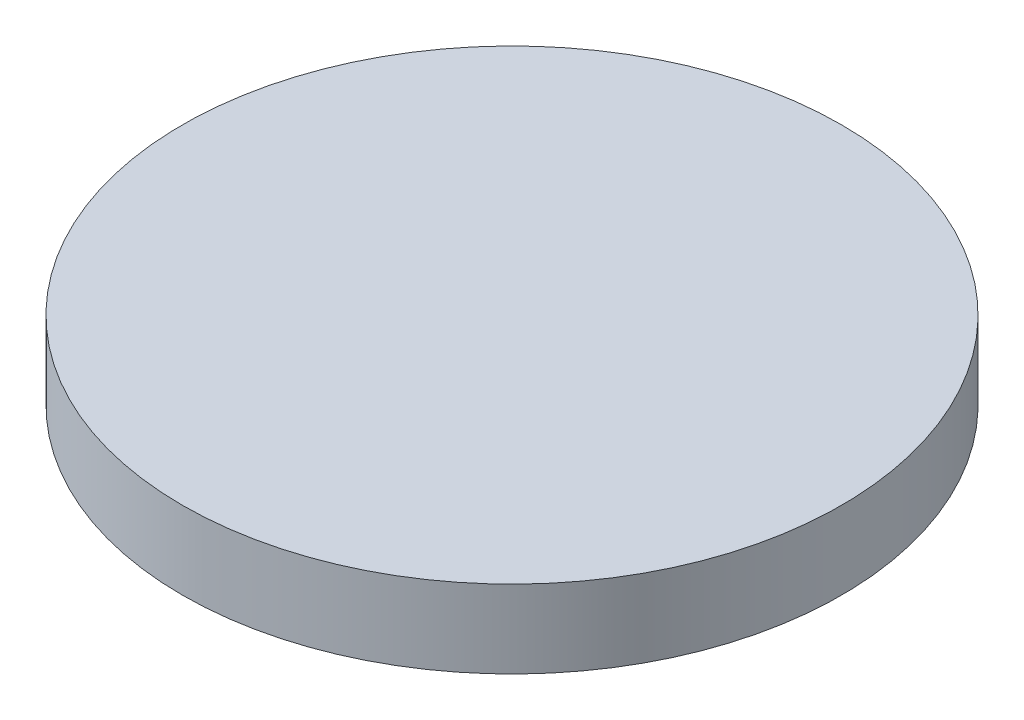
ISO-10303-21;
HEADER;
FILE_DESCRIPTION(('STEP AP214'),'2;1');
FILE_NAME('part.step','',(''),(''),'','','');
FILE_SCHEMA(('AUTOMOTIVE_DESIGN { 1 0 10303 214 1 1 1 1 }'));
ENDSEC;
DATA;
#1=APPLICATION_CONTEXT('core data for automotive mechanical design processes');
#2=APPLICATION_PROTOCOL_DEFINITION('international standard','automotive_design',2000,#1);
#3=PRODUCT_CONTEXT('',#1,'mechanical');
#4=PRODUCT('Part','Part','',(#3));
#5=PRODUCT_RELATED_PRODUCT_CATEGORY('part','',(#4));
#6=PRODUCT_DEFINITION_FORMATION('','',#4);
#7=PRODUCT_DEFINITION_CONTEXT('part definition',#1,'design');
#8=PRODUCT_DEFINITION('design','',#6,#7);
#9=PRODUCT_DEFINITION_SHAPE('','',#8);
#10=(LENGTH_UNIT() NAMED_UNIT(*) SI_UNIT(.MILLI.,.METRE.));
#11=(NAMED_UNIT(*) PLANE_ANGLE_UNIT() SI_UNIT($,.RADIAN.));
#12=(NAMED_UNIT(*) SI_UNIT($,.STERADIAN.) SOLID_ANGLE_UNIT());
#13=UNCERTAINTY_MEASURE_WITH_UNIT(LENGTH_MEASURE(1.E-05),#10,'distance_accuracy_value','');
#14=(GEOMETRIC_REPRESENTATION_CONTEXT(3) GLOBAL_UNCERTAINTY_ASSIGNED_CONTEXT((#13)) GLOBAL_UNIT_ASSIGNED_CONTEXT((#10,
#11,#12)) REPRESENTATION_CONTEXT('',''));
#15=CARTESIAN_POINT('',(0.,0.,0.));
#16=DIRECTION('',(0.,0.,1.));
#17=DIRECTION('',(1.,0.,0.));
#18=AXIS2_PLACEMENT_3D('',#15,#16,#17);
#19=CARTESIAN_POINT('',(0.,1.5,0.));
#20=DIRECTION('',(0.,-1.,0.));
#21=DIRECTION('',(0.,0.,-1.));
#22=AXIS2_PLACEMENT_3D('',#19,#20,#21);
#23=CYLINDRICAL_SURFACE('',#22,6.35);
#24=CARTESIAN_POINT('',(0.,1.5,0.));
#25=DIRECTION('',(0.,1.,0.));
#26=DIRECTION('',(0.,0.,1.));
#27=AXIS2_PLACEMENT_3D('',#24,#25,#26);
#28=CIRCLE('',#27,6.35);
#29=CARTESIAN_POINT('',(0.,1.5,6.35));
#30=VERTEX_POINT('',#29);
#31=EDGE_CURVE('E10',#30,#30,#28,.T.);
#32=ORIENTED_EDGE('',*,*,#31,.F.);
#33=EDGE_LOOP('',(#32));
#34=FACE_BOUND('',#33,.T.);
#35=CARTESIAN_POINT('',(0.,0.,0.));
#36=DIRECTION('',(0.,1.,0.));
#37=DIRECTION('',(0.,0.,1.));
#38=AXIS2_PLACEMENT_3D('',#35,#36,#37);
#39=CIRCLE('',#38,6.35);
#40=CARTESIAN_POINT('',(0.,0.,6.35));
#41=VERTEX_POINT('',#40);
#42=EDGE_CURVE('E36',#41,#41,#39,.T.);
#43=ORIENTED_EDGE('',*,*,#42,.T.);
#44=EDGE_LOOP('',(#43));
#45=FACE_BOUND('',#44,.T.);
#46=ADVANCED_FACE('F33',(#34,#45),#23,.T.);
#47=CARTESIAN_POINT('',(0.,1.5,0.));
#48=DIRECTION('',(0.,1.,0.));
#49=DIRECTION('',(0.,0.,1.));
#50=AXIS2_PLACEMENT_3D('',#47,#48,#49);
#51=PLANE('',#50);
#52=ORIENTED_EDGE('',*,*,#31,.T.);
#53=EDGE_LOOP('',(#52));
#54=FACE_BOUND('',#53,.T.);
#55=ADVANCED_FACE('F48',(#54),#51,.T.);
#56=CARTESIAN_POINT('',(0.,0.,0.));
#57=DIRECTION('',(0.,1.,0.));
#58=DIRECTION('',(0.,0.,1.));
#59=AXIS2_PLACEMENT_3D('',#56,#57,#58);
#60=PLANE('',#59);
#61=ORIENTED_EDGE('',*,*,#42,.F.);
#62=EDGE_LOOP('',(#61));
#63=FACE_BOUND('',#62,.T.);
#64=ADVANCED_FACE('F46',(#63),#60,.F.);
#65=CLOSED_SHELL('',(#46,#55,#64));
#66=MANIFOLD_SOLID_BREP('B2',#65);
#67=ADVANCED_BREP_SHAPE_REPRESENTATION('',(#18,#66),#14);
#68=SHAPE_DEFINITION_REPRESENTATION(#9,#67);
ENDSEC;
END-ISO-10303-21;
